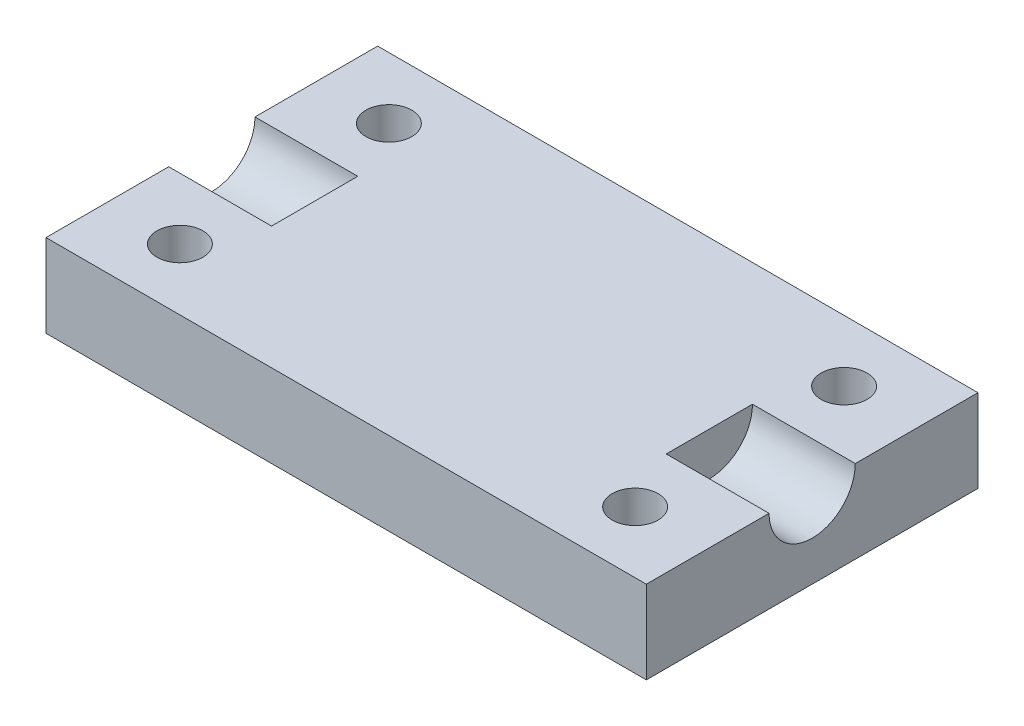
ISO-10303-21;
HEADER;
FILE_DESCRIPTION(('STEP AP214'),'2;1');
FILE_NAME('part.step','',(''),(''),'','','');
FILE_SCHEMA(('AUTOMOTIVE_DESIGN { 1 0 10303 214 1 1 1 1 }'));
ENDSEC;
DATA;
#1=APPLICATION_CONTEXT('core data for automotive mechanical design processes');
#2=APPLICATION_PROTOCOL_DEFINITION('international standard','automotive_design',2000,#1);
#3=PRODUCT_CONTEXT('',#1,'mechanical');
#4=PRODUCT('Part','Part','',(#3));
#5=PRODUCT_RELATED_PRODUCT_CATEGORY('part','',(#4));
#6=PRODUCT_DEFINITION_FORMATION('','',#4);
#7=PRODUCT_DEFINITION_CONTEXT('part definition',#1,'design');
#8=PRODUCT_DEFINITION('design','',#6,#7);
#9=PRODUCT_DEFINITION_SHAPE('','',#8);
#10=(LENGTH_UNIT() NAMED_UNIT(*) SI_UNIT(.MILLI.,.METRE.));
#11=(NAMED_UNIT(*) PLANE_ANGLE_UNIT() SI_UNIT($,.RADIAN.));
#12=(NAMED_UNIT(*) SI_UNIT($,.STERADIAN.) SOLID_ANGLE_UNIT());
#13=UNCERTAINTY_MEASURE_WITH_UNIT(LENGTH_MEASURE(1.E-05),#10,'distance_accuracy_value','');
#14=(GEOMETRIC_REPRESENTATION_CONTEXT(3) GLOBAL_UNCERTAINTY_ASSIGNED_CONTEXT((#13)) GLOBAL_UNIT_ASSIGNED_CONTEXT((#10,
#11,#12)) REPRESENTATION_CONTEXT('',''));
#15=CARTESIAN_POINT('',(0.,0.,0.));
#16=DIRECTION('',(0.,0.,1.));
#17=DIRECTION('',(1.,0.,0.));
#18=AXIS2_PLACEMENT_3D('',#15,#16,#17);
#19=CARTESIAN_POINT('',(22.987,-6.35,12.7));
#20=DIRECTION('',(1.,0.,0.));
#21=DIRECTION('',(0.,0.,-1.));
#22=AXIS2_PLACEMENT_3D('',#19,#20,#21);
#23=PLANE('',#22);
#24=CARTESIAN_POINT('',(22.987,0.,0.));
#25=DIRECTION('',(1.,0.,0.));
#26=DIRECTION('',(0.,0.,-1.));
#27=AXIS2_PLACEMENT_3D('',#24,#25,#26);
#28=CIRCLE('',#27,3.302);
#29=CARTESIAN_POINT('',(22.987,0.,3.302));
#30=VERTEX_POINT('',#29);
#31=CARTESIAN_POINT('',(22.987,0.,-3.302));
#32=VERTEX_POINT('',#31);
#33=EDGE_CURVE('E167',#30,#32,#28,.T.);
#34=ORIENTED_EDGE('',*,*,#33,.F.);
#35=DIRECTION('',(0.,0.,-1.));
#36=VECTOR('',#35,1.);
#37=CARTESIAN_POINT('',(22.987,0.,12.7));
#38=LINE('',#37,#36);
#39=CARTESIAN_POINT('',(22.987,0.,12.7));
#40=VERTEX_POINT('',#39);
#41=EDGE_CURVE('E121',#40,#30,#38,.T.);
#42=ORIENTED_EDGE('',*,*,#41,.F.);
#43=DIRECTION('',(0.,1.,0.));
#44=VECTOR('',#43,1.);
#45=CARTESIAN_POINT('',(22.987,-6.35,12.7));
#46=LINE('',#45,#44);
#47=CARTESIAN_POINT('',(22.987,-6.35,12.7));
#48=VERTEX_POINT('',#47);
#49=EDGE_CURVE('E127',#48,#40,#46,.T.);
#50=ORIENTED_EDGE('',*,*,#49,.F.);
#51=DIRECTION('',(0.,0.,-1.));
#52=VECTOR('',#51,1.);
#53=CARTESIAN_POINT('',(22.987,-6.35,12.7));
#54=LINE('',#53,#52);
#55=CARTESIAN_POINT('',(22.987,-6.35,-12.7));
#56=VERTEX_POINT('',#55);
#57=EDGE_CURVE('E126',#48,#56,#54,.T.);
#58=ORIENTED_EDGE('',*,*,#57,.T.);
#59=DIRECTION('',(0.,1.,0.));
#60=VECTOR('',#59,1.);
#61=CARTESIAN_POINT('',(22.987,-6.35,-12.7));
#62=LINE('',#61,#60);
#63=CARTESIAN_POINT('',(22.987,0.,-12.7));
#64=VERTEX_POINT('',#63);
#65=EDGE_CURVE('E133',#56,#64,#62,.T.);
#66=ORIENTED_EDGE('',*,*,#65,.T.);
#67=EDGE_CURVE('E164',#32,#64,#38,.T.);
#68=ORIENTED_EDGE('',*,*,#67,.F.);
#69=EDGE_LOOP('',(#34,#42,#50,#58,#66,#68));
#70=FACE_BOUND('',#69,.T.);
#71=ADVANCED_FACE('F33',(#70),#23,.T.);
#72=CARTESIAN_POINT('',(-22.987,-6.35,12.7));
#73=DIRECTION('',(0.,0.,1.));
#74=DIRECTION('',(1.,0.,0.));
#75=AXIS2_PLACEMENT_3D('',#72,#73,#74);
#76=PLANE('',#75);
#77=DIRECTION('',(1.,0.,0.));
#78=VECTOR('',#77,1.);
#79=CARTESIAN_POINT('',(-22.987,0.,12.7));
#80=LINE('',#79,#78);
#81=CARTESIAN_POINT('',(-22.987,0.,12.7));
#82=VERTEX_POINT('',#81);
#83=EDGE_CURVE('E119',#82,#40,#80,.T.);
#84=ORIENTED_EDGE('',*,*,#83,.F.);
#85=DIRECTION('',(0.,1.,0.));
#86=VECTOR('',#85,1.);
#87=CARTESIAN_POINT('',(-22.987,-6.35,12.7));
#88=LINE('',#87,#86);
#89=CARTESIAN_POINT('',(-22.987,-6.35,12.7));
#90=VERTEX_POINT('',#89);
#91=EDGE_CURVE('E114',#90,#82,#88,.T.);
#92=ORIENTED_EDGE('',*,*,#91,.F.);
#93=DIRECTION('',(1.,0.,0.));
#94=VECTOR('',#93,1.);
#95=CARTESIAN_POINT('',(-22.987,-6.35,12.7));
#96=LINE('',#95,#94);
#97=EDGE_CURVE('E136',#90,#48,#96,.T.);
#98=ORIENTED_EDGE('',*,*,#97,.T.);
#99=ORIENTED_EDGE('',*,*,#49,.T.);
#100=EDGE_LOOP('',(#84,#92,#98,#99));
#101=FACE_BOUND('',#100,.T.);
#102=ADVANCED_FACE('F223',(#101),#76,.T.);
#103=CARTESIAN_POINT('',(-22.987,-6.35,12.7));
#104=DIRECTION('',(-1.,0.,0.));
#105=DIRECTION('',(0.,0.,1.));
#106=AXIS2_PLACEMENT_3D('',#103,#104,#105);
#107=PLANE('',#106);
#108=CARTESIAN_POINT('',(-22.987,0.,0.));
#109=DIRECTION('',(-1.,0.,0.));
#110=DIRECTION('',(0.,0.,1.));
#111=AXIS2_PLACEMENT_3D('',#108,#109,#110);
#112=CIRCLE('',#111,3.302);
#113=CARTESIAN_POINT('',(-22.987,0.,-3.302));
#114=VERTEX_POINT('',#113);
#115=CARTESIAN_POINT('',(-22.987,0.,3.302));
#116=VERTEX_POINT('',#115);
#117=EDGE_CURVE('E96',#114,#116,#112,.T.);
#118=ORIENTED_EDGE('',*,*,#117,.F.);
#119=DIRECTION('',(0.,0.,1.));
#120=VECTOR('',#119,1.);
#121=CARTESIAN_POINT('',(-22.987,0.,12.7));
#122=LINE('',#121,#120);
#123=CARTESIAN_POINT('',(-22.987,0.,-12.7));
#124=VERTEX_POINT('',#123);
#125=EDGE_CURVE('E116',#124,#114,#122,.T.);
#126=ORIENTED_EDGE('',*,*,#125,.F.);
#127=DIRECTION('',(0.,1.,0.));
#128=VECTOR('',#127,1.);
#129=CARTESIAN_POINT('',(-22.987,-6.35,-12.7));
#130=LINE('',#129,#128);
#131=CARTESIAN_POINT('',(-22.987,-6.35,-12.7));
#132=VERTEX_POINT('',#131);
#133=EDGE_CURVE('E131',#132,#124,#130,.T.);
#134=ORIENTED_EDGE('',*,*,#133,.F.);
#135=DIRECTION('',(0.,0.,1.));
#136=VECTOR('',#135,1.);
#137=CARTESIAN_POINT('',(-22.987,-6.35,12.7));
#138=LINE('',#137,#136);
#139=EDGE_CURVE('E146',#132,#90,#138,.T.);
#140=ORIENTED_EDGE('',*,*,#139,.T.);
#141=ORIENTED_EDGE('',*,*,#91,.T.);
#142=EDGE_CURVE('E109',#116,#82,#122,.T.);
#143=ORIENTED_EDGE('',*,*,#142,.F.);
#144=EDGE_LOOP('',(#118,#126,#134,#140,#141,#143));
#145=FACE_BOUND('',#144,.T.);
#146=ADVANCED_FACE('F112',(#145),#107,.T.);
#147=CARTESIAN_POINT('',(-22.987,-6.35,-12.7));
#148=DIRECTION('',(0.,0.,-1.));
#149=DIRECTION('',(-1.,0.,0.));
#150=AXIS2_PLACEMENT_3D('',#147,#148,#149);
#151=PLANE('',#150);
#152=DIRECTION('',(-1.,0.,0.));
#153=VECTOR('',#152,1.);
#154=CARTESIAN_POINT('',(-22.987,0.,-12.7));
#155=LINE('',#154,#153);
#156=EDGE_CURVE('E117',#64,#124,#155,.T.);
#157=ORIENTED_EDGE('',*,*,#156,.F.);
#158=ORIENTED_EDGE('',*,*,#65,.F.);
#159=DIRECTION('',(-1.,0.,0.));
#160=VECTOR('',#159,1.);
#161=CARTESIAN_POINT('',(-22.987,-6.35,-12.7));
#162=LINE('',#161,#160);
#163=EDGE_CURVE('E154',#56,#132,#162,.T.);
#164=ORIENTED_EDGE('',*,*,#163,.T.);
#165=ORIENTED_EDGE('',*,*,#133,.T.);
#166=EDGE_LOOP('',(#157,#158,#164,#165));
#167=FACE_BOUND('',#166,.T.);
#168=ADVANCED_FACE('F158',(#167),#151,.T.);
#169=CARTESIAN_POINT('',(0.,-6.35,0.));
#170=DIRECTION('',(0.,-1.,0.));
#171=DIRECTION('',(0.,0.,-1.));
#172=AXIS2_PLACEMENT_3D('',#169,#170,#171);
#173=PLANE('',#172);
#174=CARTESIAN_POINT('',(-17.43075,-6.35,8.001));
#175=DIRECTION('',(0.,-1.,0.));
#176=DIRECTION('',(0.,0.,-1.));
#177=AXIS2_PLACEMENT_3D('',#174,#175,#176);
#178=CIRCLE('',#177,1.75895);
#179=CARTESIAN_POINT('',(-17.43075,-6.35,6.24205));
#180=VERTEX_POINT('',#179);
#181=EDGE_CURVE('E189',#180,#180,#178,.F.);
#182=ORIENTED_EDGE('',*,*,#181,.T.);
#183=EDGE_LOOP('',(#182));
#184=FACE_BOUND('',#183,.T.);
#185=CARTESIAN_POINT('',(-17.43075,-6.35,-8.001));
#186=DIRECTION('',(0.,-1.,0.));
#187=DIRECTION('',(0.,0.,-1.));
#188=AXIS2_PLACEMENT_3D('',#185,#186,#187);
#189=CIRCLE('',#188,1.75895);
#190=CARTESIAN_POINT('',(-17.43075,-6.35,-9.75995));
#191=VERTEX_POINT('',#190);
#192=EDGE_CURVE('E183',#191,#191,#189,.F.);
#193=ORIENTED_EDGE('',*,*,#192,.T.);
#194=EDGE_LOOP('',(#193));
#195=FACE_BOUND('',#194,.T.);
#196=CARTESIAN_POINT('',(17.43075,-6.35,-8.001));
#197=DIRECTION('',(0.,-1.,0.));
#198=DIRECTION('',(0.,0.,-1.));
#199=AXIS2_PLACEMENT_3D('',#196,#197,#198);
#200=CIRCLE('',#199,1.75895);
#201=CARTESIAN_POINT('',(17.43075,-6.35,-9.75995));
#202=VERTEX_POINT('',#201);
#203=EDGE_CURVE('E177',#202,#202,#200,.F.);
#204=ORIENTED_EDGE('',*,*,#203,.T.);
#205=EDGE_LOOP('',(#204));
#206=FACE_BOUND('',#205,.T.);
#207=CARTESIAN_POINT('',(17.43075,-6.35,8.001));
#208=DIRECTION('',(0.,-1.,0.));
#209=DIRECTION('',(0.,0.,-1.));
#210=AXIS2_PLACEMENT_3D('',#207,#208,#209);
#211=CIRCLE('',#210,1.75895);
#212=CARTESIAN_POINT('',(17.43075,-6.35,6.24205));
#213=VERTEX_POINT('',#212);
#214=EDGE_CURVE('E171',#213,#213,#211,.F.);
#215=ORIENTED_EDGE('',*,*,#214,.T.);
#216=EDGE_LOOP('',(#215));
#217=FACE_BOUND('',#216,.T.);
#218=ORIENTED_EDGE('',*,*,#57,.F.);
#219=ORIENTED_EDGE('',*,*,#97,.F.);
#220=ORIENTED_EDGE('',*,*,#139,.F.);
#221=ORIENTED_EDGE('',*,*,#163,.F.);
#222=EDGE_LOOP('',(#218,#219,#220,#221));
#223=FACE_BOUND('',#222,.T.);
#224=ADVANCED_FACE('F153',(#184,#195,#206,#217,#223),#173,.T.);
#225=CARTESIAN_POINT('',(0.,0.,0.));
#226=DIRECTION('',(0.,-1.,0.));
#227=DIRECTION('',(0.,0.,-1.));
#228=AXIS2_PLACEMENT_3D('',#225,#226,#227);
#229=PLANE('',#228);
#230=CARTESIAN_POINT('',(-17.43075,0.,8.001));
#231=DIRECTION('',(0.,1.,0.));
#232=DIRECTION('',(0.,0.,1.));
#233=AXIS2_PLACEMENT_3D('',#230,#231,#232);
#234=CIRCLE('',#233,1.75895);
#235=CARTESIAN_POINT('',(-17.43075,0.,9.75995));
#236=VERTEX_POINT('',#235);
#237=EDGE_CURVE('E186',#236,#236,#234,.T.);
#238=ORIENTED_EDGE('',*,*,#237,.F.);
#239=EDGE_LOOP('',(#238));
#240=FACE_BOUND('',#239,.T.);
#241=CARTESIAN_POINT('',(-17.43075,0.,-8.001));
#242=DIRECTION('',(0.,1.,0.));
#243=DIRECTION('',(0.,0.,1.));
#244=AXIS2_PLACEMENT_3D('',#241,#242,#243);
#245=CIRCLE('',#244,1.75895);
#246=CARTESIAN_POINT('',(-17.43075,0.,-6.24205));
#247=VERTEX_POINT('',#246);
#248=EDGE_CURVE('E180',#247,#247,#245,.T.);
#249=ORIENTED_EDGE('',*,*,#248,.F.);
#250=EDGE_LOOP('',(#249));
#251=FACE_BOUND('',#250,.T.);
#252=CARTESIAN_POINT('',(17.43075,0.,-8.001));
#253=DIRECTION('',(0.,1.,0.));
#254=DIRECTION('',(0.,0.,1.));
#255=AXIS2_PLACEMENT_3D('',#252,#253,#254);
#256=CIRCLE('',#255,1.75895);
#257=CARTESIAN_POINT('',(17.43075,0.,-6.24205));
#258=VERTEX_POINT('',#257);
#259=EDGE_CURVE('E174',#258,#258,#256,.T.);
#260=ORIENTED_EDGE('',*,*,#259,.F.);
#261=EDGE_LOOP('',(#260));
#262=FACE_BOUND('',#261,.T.);
#263=CARTESIAN_POINT('',(17.43075,0.,8.001));
#264=DIRECTION('',(0.,1.,0.));
#265=DIRECTION('',(0.,0.,1.));
#266=AXIS2_PLACEMENT_3D('',#263,#264,#265);
#267=CIRCLE('',#266,1.75895);
#268=CARTESIAN_POINT('',(17.43075,0.,9.75994999999999));
#269=VERTEX_POINT('',#268);
#270=EDGE_CURVE('E104',#269,#269,#267,.T.);
#271=ORIENTED_EDGE('',*,*,#270,.F.);
#272=EDGE_LOOP('',(#271));
#273=FACE_BOUND('',#272,.T.);
#274=DIRECTION('',(0.,0.,-1.));
#275=VECTOR('',#274,1.);
#276=CARTESIAN_POINT('',(-15.113,0.,0.));
#277=LINE('',#276,#275);
#278=CARTESIAN_POINT('',(-15.113,0.,3.302));
#279=VERTEX_POINT('',#278);
#280=CARTESIAN_POINT('',(-15.113,0.,-3.302));
#281=VERTEX_POINT('',#280);
#282=EDGE_CURVE('E111',#279,#281,#277,.T.);
#283=ORIENTED_EDGE('',*,*,#282,.F.);
#284=DIRECTION('',(-1.,0.,0.));
#285=VECTOR('',#284,1.);
#286=CARTESIAN_POINT('',(-15.113,0.,3.302));
#287=LINE('',#286,#285);
#288=EDGE_CURVE('E11',#279,#116,#287,.T.);
#289=ORIENTED_EDGE('',*,*,#288,.T.);
#290=ORIENTED_EDGE('',*,*,#142,.T.);
#291=ORIENTED_EDGE('',*,*,#83,.T.);
#292=ORIENTED_EDGE('',*,*,#41,.T.);
#293=DIRECTION('',(1.,0.,0.));
#294=VECTOR('',#293,1.);
#295=CARTESIAN_POINT('',(15.113,0.,3.302));
#296=LINE('',#295,#294);
#297=CARTESIAN_POINT('',(15.113,0.,3.302));
#298=VERTEX_POINT('',#297);
#299=EDGE_CURVE('E138',#30,#298,#296,.F.);
#300=ORIENTED_EDGE('',*,*,#299,.T.);
#301=DIRECTION('',(0.,0.,1.));
#302=VECTOR('',#301,1.);
#303=CARTESIAN_POINT('',(15.113,0.,0.));
#304=LINE('',#303,#302);
#305=CARTESIAN_POINT('',(15.113,0.,-3.302));
#306=VERTEX_POINT('',#305);
#307=EDGE_CURVE('E129',#306,#298,#304,.T.);
#308=ORIENTED_EDGE('',*,*,#307,.F.);
#309=DIRECTION('',(1.,0.,0.));
#310=VECTOR('',#309,1.);
#311=CARTESIAN_POINT('',(15.113,0.,-3.302));
#312=LINE('',#311,#310);
#313=EDGE_CURVE('E141',#306,#32,#312,.T.);
#314=ORIENTED_EDGE('',*,*,#313,.T.);
#315=ORIENTED_EDGE('',*,*,#67,.T.);
#316=ORIENTED_EDGE('',*,*,#156,.T.);
#317=ORIENTED_EDGE('',*,*,#125,.T.);
#318=DIRECTION('',(-1.,0.,0.));
#319=VECTOR('',#318,1.);
#320=CARTESIAN_POINT('',(-15.113,0.,-3.302));
#321=LINE('',#320,#319);
#322=EDGE_CURVE('E40',#114,#281,#321,.F.);
#323=ORIENTED_EDGE('',*,*,#322,.T.);
#324=EDGE_LOOP('',(#283,#289,#290,#291,#292,#300,#308,#314,#315,#316,#317,#323));
#325=FACE_BOUND('',#324,.T.);
#326=ADVANCED_FACE('F107',(#240,#251,#262,#273,#325),#229,.F.);
#327=CARTESIAN_POINT('',(15.113,0.,0.));
#328=DIRECTION('',(1.,0.,0.));
#329=DIRECTION('',(0.,0.,-1.));
#330=AXIS2_PLACEMENT_3D('',#327,#328,#329);
#331=CYLINDRICAL_SURFACE('',#330,3.302);
#332=CARTESIAN_POINT('',(15.113,0.,0.));
#333=DIRECTION('',(1.,0.,0.));
#334=DIRECTION('',(0.,0.,-1.));
#335=AXIS2_PLACEMENT_3D('',#332,#333,#334);
#336=CIRCLE('',#335,3.302);
#337=EDGE_CURVE('E53',#298,#306,#336,.T.);
#338=ORIENTED_EDGE('',*,*,#337,.F.);
#339=ORIENTED_EDGE('',*,*,#299,.F.);
#340=ORIENTED_EDGE('',*,*,#33,.T.);
#341=ORIENTED_EDGE('',*,*,#313,.F.);
#342=EDGE_LOOP('',(#338,#339,#340,#341));
#343=FACE_BOUND('',#342,.T.);
#344=ADVANCED_FACE('F199',(#343),#331,.F.);
#345=CARTESIAN_POINT('',(15.113,0.,0.));
#346=DIRECTION('',(1.,0.,0.));
#347=DIRECTION('',(0.,0.,-1.));
#348=AXIS2_PLACEMENT_3D('',#345,#346,#347);
#349=PLANE('',#348);
#350=ORIENTED_EDGE('',*,*,#307,.T.);
#351=ORIENTED_EDGE('',*,*,#337,.T.);
#352=EDGE_LOOP('',(#350,#351));
#353=FACE_BOUND('',#352,.T.);
#354=ADVANCED_FACE('F233',(#353),#349,.T.);
#355=CARTESIAN_POINT('',(-15.113,0.,0.));
#356=DIRECTION('',(-1.,0.,0.));
#357=DIRECTION('',(0.,0.,1.));
#358=AXIS2_PLACEMENT_3D('',#355,#356,#357);
#359=CYLINDRICAL_SURFACE('',#358,3.302);
#360=CARTESIAN_POINT('',(-15.113,0.,0.));
#361=DIRECTION('',(-1.,0.,0.));
#362=DIRECTION('',(0.,0.,1.));
#363=AXIS2_PLACEMENT_3D('',#360,#361,#362);
#364=CIRCLE('',#363,3.302);
#365=EDGE_CURVE('E46',#281,#279,#364,.T.);
#366=ORIENTED_EDGE('',*,*,#365,.F.);
#367=ORIENTED_EDGE('',*,*,#322,.F.);
#368=ORIENTED_EDGE('',*,*,#117,.T.);
#369=ORIENTED_EDGE('',*,*,#288,.F.);
#370=EDGE_LOOP('',(#366,#367,#368,#369));
#371=FACE_BOUND('',#370,.T.);
#372=ADVANCED_FACE('F97',(#371),#359,.F.);
#373=CARTESIAN_POINT('',(-15.113,0.,0.));
#374=DIRECTION('',(-1.,0.,0.));
#375=DIRECTION('',(0.,0.,1.));
#376=AXIS2_PLACEMENT_3D('',#373,#374,#375);
#377=PLANE('',#376);
#378=ORIENTED_EDGE('',*,*,#282,.T.);
#379=ORIENTED_EDGE('',*,*,#365,.T.);
#380=EDGE_LOOP('',(#378,#379));
#381=FACE_BOUND('',#380,.T.);
#382=ADVANCED_FACE('F210',(#381),#377,.T.);
#383=CARTESIAN_POINT('',(17.43075,-6.351,8.001));
#384=DIRECTION('',(0.,1.,0.));
#385=DIRECTION('',(0.,0.,1.));
#386=AXIS2_PLACEMENT_3D('',#383,#384,#385);
#387=CYLINDRICAL_SURFACE('',#386,1.75895);
#388=ORIENTED_EDGE('',*,*,#214,.F.);
#389=EDGE_LOOP('',(#388));
#390=FACE_BOUND('',#389,.T.);
#391=ORIENTED_EDGE('',*,*,#270,.T.);
#392=EDGE_LOOP('',(#391));
#393=FACE_BOUND('',#392,.T.);
#394=ADVANCED_FACE('F207',(#390,#393),#387,.F.);
#395=CARTESIAN_POINT('',(17.43075,-6.351,-8.001));
#396=DIRECTION('',(0.,1.,0.));
#397=DIRECTION('',(0.,0.,1.));
#398=AXIS2_PLACEMENT_3D('',#395,#396,#397);
#399=CYLINDRICAL_SURFACE('',#398,1.75895);
#400=ORIENTED_EDGE('',*,*,#203,.F.);
#401=EDGE_LOOP('',(#400));
#402=FACE_BOUND('',#401,.T.);
#403=ORIENTED_EDGE('',*,*,#259,.T.);
#404=EDGE_LOOP('',(#403));
#405=FACE_BOUND('',#404,.T.);
#406=ADVANCED_FACE('F209',(#402,#405),#399,.F.);
#407=CARTESIAN_POINT('',(-17.43075,-6.351,-8.001));
#408=DIRECTION('',(0.,1.,0.));
#409=DIRECTION('',(0.,0.,1.));
#410=AXIS2_PLACEMENT_3D('',#407,#408,#409);
#411=CYLINDRICAL_SURFACE('',#410,1.75895);
#412=ORIENTED_EDGE('',*,*,#192,.F.);
#413=EDGE_LOOP('',(#412));
#414=FACE_BOUND('',#413,.T.);
#415=ORIENTED_EDGE('',*,*,#248,.T.);
#416=EDGE_LOOP('',(#415));
#417=FACE_BOUND('',#416,.T.);
#418=ADVANCED_FACE('F217',(#414,#417),#411,.F.);
#419=CARTESIAN_POINT('',(-17.43075,-6.351,8.001));
#420=DIRECTION('',(0.,1.,0.));
#421=DIRECTION('',(0.,0.,1.));
#422=AXIS2_PLACEMENT_3D('',#419,#420,#421);
#423=CYLINDRICAL_SURFACE('',#422,1.75895);
#424=ORIENTED_EDGE('',*,*,#181,.F.);
#425=EDGE_LOOP('',(#424));
#426=FACE_BOUND('',#425,.T.);
#427=ORIENTED_EDGE('',*,*,#237,.T.);
#428=EDGE_LOOP('',(#427));
#429=FACE_BOUND('',#428,.T.);
#430=ADVANCED_FACE('F195',(#426,#429),#423,.F.);
#431=CLOSED_SHELL('',(#71,#102,#146,#168,#224,#326,#344,#354,#372,#382,#394,#406,#418,#430));
#432=MANIFOLD_SOLID_BREP('B2',#431);
#433=ADVANCED_BREP_SHAPE_REPRESENTATION('',(#18,#432),#14);
#434=SHAPE_DEFINITION_REPRESENTATION(#9,#433);
ENDSEC;
END-ISO-10303-21;
